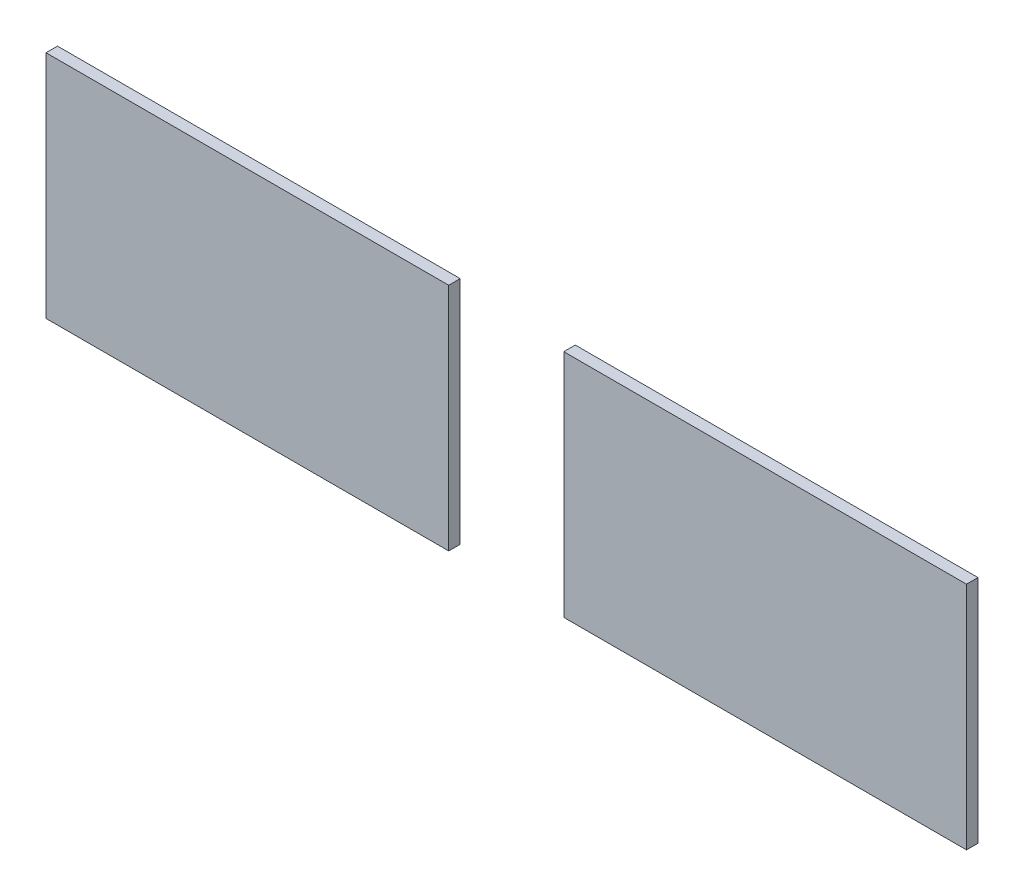
ISO-10303-21;
HEADER;
FILE_DESCRIPTION(('STEP AP214'),'2;1');
FILE_NAME('part.step','',(''),(''),'','','');
FILE_SCHEMA(('AUTOMOTIVE_DESIGN { 1 0 10303 214 1 1 1 1 }'));
ENDSEC;
DATA;
#1=APPLICATION_CONTEXT('core data for automotive mechanical design processes');
#2=APPLICATION_PROTOCOL_DEFINITION('international standard','automotive_design',2000,#1);
#3=PRODUCT_CONTEXT('',#1,'mechanical');
#4=PRODUCT('Part','Part','',(#3));
#5=PRODUCT_RELATED_PRODUCT_CATEGORY('part','',(#4));
#6=PRODUCT_DEFINITION_FORMATION('','',#4);
#7=PRODUCT_DEFINITION_CONTEXT('part definition',#1,'design');
#8=PRODUCT_DEFINITION('design','',#6,#7);
#9=PRODUCT_DEFINITION_SHAPE('','',#8);
#10=(LENGTH_UNIT() NAMED_UNIT(*) SI_UNIT(.MILLI.,.METRE.));
#11=(NAMED_UNIT(*) PLANE_ANGLE_UNIT() SI_UNIT($,.RADIAN.));
#12=(NAMED_UNIT(*) SI_UNIT($,.STERADIAN.) SOLID_ANGLE_UNIT());
#13=UNCERTAINTY_MEASURE_WITH_UNIT(LENGTH_MEASURE(1.E-05),#10,'distance_accuracy_value','');
#14=(GEOMETRIC_REPRESENTATION_CONTEXT(3) GLOBAL_UNCERTAINTY_ASSIGNED_CONTEXT((#13)) GLOBAL_UNIT_ASSIGNED_CONTEXT((#10,
#11,#12)) REPRESENTATION_CONTEXT('',''));
#15=CARTESIAN_POINT('',(0.,0.,0.));
#16=DIRECTION('',(0.,0.,1.));
#17=DIRECTION('',(1.,0.,0.));
#18=AXIS2_PLACEMENT_3D('',#15,#16,#17);
#19=CARTESIAN_POINT('',(0.8,0.2,0.02));
#20=DIRECTION('',(-1.,0.,0.));
#21=DIRECTION('',(0.,0.,1.));
#22=AXIS2_PLACEMENT_3D('',#19,#20,#21);
#23=PLANE('',#22);
#24=DIRECTION('',(0.,1.,0.));
#25=VECTOR('',#24,1.);
#26=CARTESIAN_POINT('',(0.8,0.2,0.));
#27=LINE('',#26,#25);
#28=CARTESIAN_POINT('',(0.8,-0.2,0.));
#29=VERTEX_POINT('',#28);
#30=CARTESIAN_POINT('',(0.8,0.2,0.));
#31=VERTEX_POINT('',#30);
#32=EDGE_CURVE('E103',#29,#31,#27,.T.);
#33=ORIENTED_EDGE('',*,*,#32,.T.);
#34=DIRECTION('',(0.,0.,-1.));
#35=VECTOR('',#34,1.);
#36=CARTESIAN_POINT('',(0.8,0.2,0.02));
#37=LINE('',#36,#35);
#38=CARTESIAN_POINT('',(0.8,0.2,0.02));
#39=VERTEX_POINT('',#38);
#40=EDGE_CURVE('E12',#39,#31,#37,.T.);
#41=ORIENTED_EDGE('',*,*,#40,.F.);
#42=DIRECTION('',(0.,1.,0.));
#43=VECTOR('',#42,1.);
#44=CARTESIAN_POINT('',(0.8,0.2,0.02));
#45=LINE('',#44,#43);
#46=CARTESIAN_POINT('',(0.8,-0.2,0.02));
#47=VERTEX_POINT('',#46);
#48=EDGE_CURVE('E91',#47,#39,#45,.T.);
#49=ORIENTED_EDGE('',*,*,#48,.F.);
#50=DIRECTION('',(0.,0.,-1.));
#51=VECTOR('',#50,1.);
#52=CARTESIAN_POINT('',(0.8,-0.2,0.02));
#53=LINE('',#52,#51);
#54=EDGE_CURVE('E99',#47,#29,#53,.T.);
#55=ORIENTED_EDGE('',*,*,#54,.T.);
#56=EDGE_LOOP('',(#33,#41,#49,#55));
#57=FACE_BOUND('',#56,.T.);
#58=ADVANCED_FACE('F40',(#57),#23,.F.);
#59=CARTESIAN_POINT('',(0.1,0.2,0.02));
#60=DIRECTION('',(0.,-1.,0.));
#61=DIRECTION('',(0.,0.,-1.));
#62=AXIS2_PLACEMENT_3D('',#59,#60,#61);
#63=PLANE('',#62);
#64=DIRECTION('',(-1.,0.,0.));
#65=VECTOR('',#64,1.);
#66=CARTESIAN_POINT('',(0.1,0.2,0.));
#67=LINE('',#66,#65);
#68=CARTESIAN_POINT('',(0.1,0.2,0.));
#69=VERTEX_POINT('',#68);
#70=EDGE_CURVE('E95',#31,#69,#67,.T.);
#71=ORIENTED_EDGE('',*,*,#70,.T.);
#72=DIRECTION('',(0.,0.,-1.));
#73=VECTOR('',#72,1.);
#74=CARTESIAN_POINT('',(0.1,0.2,0.02));
#75=LINE('',#74,#73);
#76=CARTESIAN_POINT('',(0.1,0.2,0.02));
#77=VERTEX_POINT('',#76);
#78=EDGE_CURVE('E48',#77,#69,#75,.T.);
#79=ORIENTED_EDGE('',*,*,#78,.F.);
#80=DIRECTION('',(-1.,0.,0.));
#81=VECTOR('',#80,1.);
#82=CARTESIAN_POINT('',(0.1,0.2,0.02));
#83=LINE('',#82,#81);
#84=EDGE_CURVE('E86',#39,#77,#83,.T.);
#85=ORIENTED_EDGE('',*,*,#84,.F.);
#86=ORIENTED_EDGE('',*,*,#40,.T.);
#87=EDGE_LOOP('',(#71,#79,#85,#86));
#88=FACE_BOUND('',#87,.T.);
#89=ADVANCED_FACE('F94',(#88),#63,.F.);
#90=CARTESIAN_POINT('',(0.1,0.2,0.02));
#91=DIRECTION('',(1.,0.,0.));
#92=DIRECTION('',(0.,0.,-1.));
#93=AXIS2_PLACEMENT_3D('',#90,#91,#92);
#94=PLANE('',#93);
#95=DIRECTION('',(0.,-1.,0.));
#96=VECTOR('',#95,1.);
#97=CARTESIAN_POINT('',(0.1,0.2,0.));
#98=LINE('',#97,#96);
#99=CARTESIAN_POINT('',(0.1,-0.2,0.));
#100=VERTEX_POINT('',#99);
#101=EDGE_CURVE('E73',#69,#100,#98,.T.);
#102=ORIENTED_EDGE('',*,*,#101,.T.);
#103=DIRECTION('',(0.,0.,-1.));
#104=VECTOR('',#103,1.);
#105=CARTESIAN_POINT('',(0.1,-0.2,0.02));
#106=LINE('',#105,#104);
#107=CARTESIAN_POINT('',(0.1,-0.2,0.02));
#108=VERTEX_POINT('',#107);
#109=EDGE_CURVE('E96',#108,#100,#106,.T.);
#110=ORIENTED_EDGE('',*,*,#109,.F.);
#111=DIRECTION('',(0.,-1.,0.));
#112=VECTOR('',#111,1.);
#113=CARTESIAN_POINT('',(0.1,0.2,0.02));
#114=LINE('',#113,#112);
#115=EDGE_CURVE('E89',#77,#108,#114,.T.);
#116=ORIENTED_EDGE('',*,*,#115,.F.);
#117=ORIENTED_EDGE('',*,*,#78,.T.);
#118=EDGE_LOOP('',(#102,#110,#116,#117));
#119=FACE_BOUND('',#118,.T.);
#120=ADVANCED_FACE('F97',(#119),#94,.F.);
#121=CARTESIAN_POINT('',(0.1,-0.2,0.02));
#122=DIRECTION('',(0.,1.,0.));
#123=DIRECTION('',(0.,0.,1.));
#124=AXIS2_PLACEMENT_3D('',#121,#122,#123);
#125=PLANE('',#124);
#126=DIRECTION('',(1.,0.,0.));
#127=VECTOR('',#126,1.);
#128=CARTESIAN_POINT('',(0.1,-0.2,0.));
#129=LINE('',#128,#127);
#130=EDGE_CURVE('E79',#100,#29,#129,.T.);
#131=ORIENTED_EDGE('',*,*,#130,.T.);
#132=ORIENTED_EDGE('',*,*,#54,.F.);
#133=DIRECTION('',(1.,0.,0.));
#134=VECTOR('',#133,1.);
#135=CARTESIAN_POINT('',(0.1,-0.2,0.02));
#136=LINE('',#135,#134);
#137=EDGE_CURVE('E56',#108,#47,#136,.T.);
#138=ORIENTED_EDGE('',*,*,#137,.F.);
#139=ORIENTED_EDGE('',*,*,#109,.T.);
#140=EDGE_LOOP('',(#131,#132,#138,#139));
#141=FACE_BOUND('',#140,.T.);
#142=ADVANCED_FACE('F110',(#141),#125,.F.);
#143=CARTESIAN_POINT('',(0.8,-0.2,0.02));
#144=DIRECTION('',(0.,0.,1.));
#145=DIRECTION('',(1.,0.,0.));
#146=AXIS2_PLACEMENT_3D('',#143,#144,#145);
#147=PLANE('',#146);
#148=ORIENTED_EDGE('',*,*,#48,.T.);
#149=ORIENTED_EDGE('',*,*,#84,.T.);
#150=ORIENTED_EDGE('',*,*,#115,.T.);
#151=ORIENTED_EDGE('',*,*,#137,.T.);
#152=EDGE_LOOP('',(#148,#149,#150,#151));
#153=FACE_BOUND('',#152,.T.);
#154=ADVANCED_FACE('F87',(#153),#147,.T.);
#155=CARTESIAN_POINT('',(0.8,-0.2,0.));
#156=DIRECTION('',(0.,0.,1.));
#157=DIRECTION('',(1.,0.,0.));
#158=AXIS2_PLACEMENT_3D('',#155,#156,#157);
#159=PLANE('',#158);
#160=ORIENTED_EDGE('',*,*,#32,.F.);
#161=ORIENTED_EDGE('',*,*,#130,.F.);
#162=ORIENTED_EDGE('',*,*,#101,.F.);
#163=ORIENTED_EDGE('',*,*,#70,.F.);
#164=EDGE_LOOP('',(#160,#161,#162,#163));
#165=FACE_BOUND('',#164,.T.);
#166=ADVANCED_FACE('F113',(#165),#159,.F.);
#167=CLOSED_SHELL('',(#58,#89,#120,#142,#154,#166));
#168=MANIFOLD_SOLID_BREP('B2',#167);
#169=CARTESIAN_POINT('',(-0.1,0.2,0.02));
#170=DIRECTION('',(-1.,0.,0.));
#171=DIRECTION('',(0.,-1.,0.));
#172=AXIS2_PLACEMENT_3D('',#169,#170,#171);
#173=PLANE('',#172);
#174=DIRECTION('',(0.,1.,0.));
#175=VECTOR('',#174,1.);
#176=CARTESIAN_POINT('',(-0.1,0.2,0.));
#177=LINE('',#176,#175);
#178=CARTESIAN_POINT('',(-0.0999999999999999,-0.2,0.));
#179=VERTEX_POINT('',#178);
#180=CARTESIAN_POINT('',(-0.1,0.2,0.));
#181=VERTEX_POINT('',#180);
#182=EDGE_CURVE('E226',#179,#181,#177,.T.);
#183=ORIENTED_EDGE('',*,*,#182,.T.);
#184=DIRECTION('',(0.,0.,-1.));
#185=VECTOR('',#184,1.);
#186=CARTESIAN_POINT('',(-0.1,0.2,0.02));
#187=LINE('',#186,#185);
#188=CARTESIAN_POINT('',(-0.1,0.2,0.02));
#189=VERTEX_POINT('',#188);
#190=EDGE_CURVE('E38',#189,#181,#187,.T.);
#191=ORIENTED_EDGE('',*,*,#190,.F.);
#192=DIRECTION('',(0.,1.,0.));
#193=VECTOR('',#192,1.);
#194=CARTESIAN_POINT('',(-0.1,0.2,0.02));
#195=LINE('',#194,#193);
#196=CARTESIAN_POINT('',(-0.0999999999999999,-0.2,0.02));
#197=VERTEX_POINT('',#196);
#198=EDGE_CURVE('E214',#197,#189,#195,.T.);
#199=ORIENTED_EDGE('',*,*,#198,.F.);
#200=DIRECTION('',(0.,0.,-1.));
#201=VECTOR('',#200,1.);
#202=CARTESIAN_POINT('',(-0.0999999999999999,-0.2,0.02));
#203=LINE('',#202,#201);
#204=EDGE_CURVE('E222',#197,#179,#203,.T.);
#205=ORIENTED_EDGE('',*,*,#204,.T.);
#206=EDGE_LOOP('',(#183,#191,#199,#205));
#207=FACE_BOUND('',#206,.T.);
#208=ADVANCED_FACE('F163',(#207),#173,.F.);
#209=CARTESIAN_POINT('',(-0.8,0.2,0.02));
#210=DIRECTION('',(0.,-1.,0.));
#211=DIRECTION('',(0.,0.,-1.));
#212=AXIS2_PLACEMENT_3D('',#209,#210,#211);
#213=PLANE('',#212);
#214=DIRECTION('',(-1.,0.,0.));
#215=VECTOR('',#214,1.);
#216=CARTESIAN_POINT('',(-0.8,0.2,0.));
#217=LINE('',#216,#215);
#218=CARTESIAN_POINT('',(-0.8,0.2,0.));
#219=VERTEX_POINT('',#218);
#220=EDGE_CURVE('E218',#181,#219,#217,.T.);
#221=ORIENTED_EDGE('',*,*,#220,.T.);
#222=DIRECTION('',(0.,0.,-1.));
#223=VECTOR('',#222,1.);
#224=CARTESIAN_POINT('',(-0.8,0.2,0.02));
#225=LINE('',#224,#223);
#226=CARTESIAN_POINT('',(-0.8,0.2,0.02));
#227=VERTEX_POINT('',#226);
#228=EDGE_CURVE('E171',#227,#219,#225,.T.);
#229=ORIENTED_EDGE('',*,*,#228,.F.);
#230=DIRECTION('',(-1.,0.,0.));
#231=VECTOR('',#230,1.);
#232=CARTESIAN_POINT('',(-0.8,0.2,0.02));
#233=LINE('',#232,#231);
#234=EDGE_CURVE('E209',#189,#227,#233,.T.);
#235=ORIENTED_EDGE('',*,*,#234,.F.);
#236=ORIENTED_EDGE('',*,*,#190,.T.);
#237=EDGE_LOOP('',(#221,#229,#235,#236));
#238=FACE_BOUND('',#237,.T.);
#239=ADVANCED_FACE('F217',(#238),#213,.F.);
#240=CARTESIAN_POINT('',(-0.8,0.2,0.02));
#241=DIRECTION('',(1.,0.,0.));
#242=DIRECTION('',(0.,0.,-1.));
#243=AXIS2_PLACEMENT_3D('',#240,#241,#242);
#244=PLANE('',#243);
#245=DIRECTION('',(0.,-1.,0.));
#246=VECTOR('',#245,1.);
#247=CARTESIAN_POINT('',(-0.8,0.2,0.));
#248=LINE('',#247,#246);
#249=CARTESIAN_POINT('',(-0.8,-0.2,0.));
#250=VERTEX_POINT('',#249);
#251=EDGE_CURVE('E196',#219,#250,#248,.T.);
#252=ORIENTED_EDGE('',*,*,#251,.T.);
#253=DIRECTION('',(0.,0.,-1.));
#254=VECTOR('',#253,1.);
#255=CARTESIAN_POINT('',(-0.8,-0.2,0.02));
#256=LINE('',#255,#254);
#257=CARTESIAN_POINT('',(-0.8,-0.2,0.02));
#258=VERTEX_POINT('',#257);
#259=EDGE_CURVE('E219',#258,#250,#256,.T.);
#260=ORIENTED_EDGE('',*,*,#259,.F.);
#261=DIRECTION('',(0.,-1.,0.));
#262=VECTOR('',#261,1.);
#263=CARTESIAN_POINT('',(-0.8,0.2,0.02));
#264=LINE('',#263,#262);
#265=EDGE_CURVE('E212',#227,#258,#264,.T.);
#266=ORIENTED_EDGE('',*,*,#265,.F.);
#267=ORIENTED_EDGE('',*,*,#228,.T.);
#268=EDGE_LOOP('',(#252,#260,#266,#267));
#269=FACE_BOUND('',#268,.T.);
#270=ADVANCED_FACE('F220',(#269),#244,.F.);
#271=CARTESIAN_POINT('',(-0.8,-0.2,0.02));
#272=DIRECTION('',(0.,1.,0.));
#273=DIRECTION('',(0.,0.,1.));
#274=AXIS2_PLACEMENT_3D('',#271,#272,#273);
#275=PLANE('',#274);
#276=DIRECTION('',(1.,0.,0.));
#277=VECTOR('',#276,1.);
#278=CARTESIAN_POINT('',(-0.8,-0.2,0.));
#279=LINE('',#278,#277);
#280=EDGE_CURVE('E202',#250,#179,#279,.T.);
#281=ORIENTED_EDGE('',*,*,#280,.T.);
#282=ORIENTED_EDGE('',*,*,#204,.F.);
#283=DIRECTION('',(1.,0.,0.));
#284=VECTOR('',#283,1.);
#285=CARTESIAN_POINT('',(-0.8,-0.2,0.02));
#286=LINE('',#285,#284);
#287=EDGE_CURVE('E179',#258,#197,#286,.T.);
#288=ORIENTED_EDGE('',*,*,#287,.F.);
#289=ORIENTED_EDGE('',*,*,#259,.T.);
#290=EDGE_LOOP('',(#281,#282,#288,#289));
#291=FACE_BOUND('',#290,.T.);
#292=ADVANCED_FACE('F233',(#291),#275,.F.);
#293=CARTESIAN_POINT('',(-0.0999999999999999,-0.2,0.02));
#294=DIRECTION('',(0.,0.,1.));
#295=DIRECTION('',(1.,0.,0.));
#296=AXIS2_PLACEMENT_3D('',#293,#294,#295);
#297=PLANE('',#296);
#298=ORIENTED_EDGE('',*,*,#198,.T.);
#299=ORIENTED_EDGE('',*,*,#234,.T.);
#300=ORIENTED_EDGE('',*,*,#265,.T.);
#301=ORIENTED_EDGE('',*,*,#287,.T.);
#302=EDGE_LOOP('',(#298,#299,#300,#301));
#303=FACE_BOUND('',#302,.T.);
#304=ADVANCED_FACE('F210',(#303),#297,.T.);
#305=CARTESIAN_POINT('',(-0.0999999999999999,-0.2,0.));
#306=DIRECTION('',(0.,0.,1.));
#307=DIRECTION('',(1.,0.,0.));
#308=AXIS2_PLACEMENT_3D('',#305,#306,#307);
#309=PLANE('',#308);
#310=ORIENTED_EDGE('',*,*,#182,.F.);
#311=ORIENTED_EDGE('',*,*,#280,.F.);
#312=ORIENTED_EDGE('',*,*,#251,.F.);
#313=ORIENTED_EDGE('',*,*,#220,.F.);
#314=EDGE_LOOP('',(#310,#311,#312,#313));
#315=FACE_BOUND('',#314,.T.);
#316=ADVANCED_FACE('F236',(#315),#309,.F.);
#317=CLOSED_SHELL('',(#208,#239,#270,#292,#304,#316));
#318=MANIFOLD_SOLID_BREP('B6',#317);
#319=ADVANCED_BREP_SHAPE_REPRESENTATION('',(#18,#168,#318),#14);
#320=SHAPE_DEFINITION_REPRESENTATION(#9,#319);
ENDSEC;
END-ISO-10303-21;
